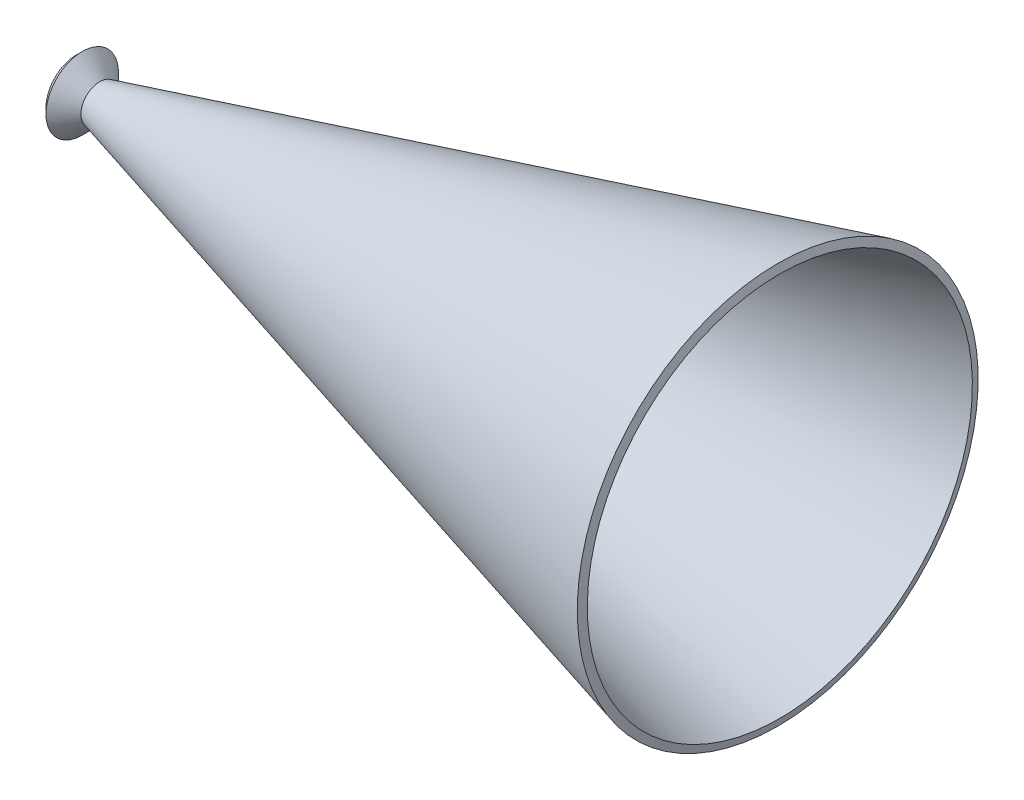
ISO-10303-21;
HEADER;
FILE_DESCRIPTION(('STEP AP214'),'2;1');
FILE_NAME('part.step','',(''),(''),'','','');
FILE_SCHEMA(('AUTOMOTIVE_DESIGN { 1 0 10303 214 1 1 1 1 }'));
ENDSEC;
DATA;
#1=APPLICATION_CONTEXT('core data for automotive mechanical design processes');
#2=APPLICATION_PROTOCOL_DEFINITION('international standard','automotive_design',2000,#1);
#3=PRODUCT_CONTEXT('',#1,'mechanical');
#4=PRODUCT('Part','Part','',(#3));
#5=PRODUCT_RELATED_PRODUCT_CATEGORY('part','',(#4));
#6=PRODUCT_DEFINITION_FORMATION('','',#4);
#7=PRODUCT_DEFINITION_CONTEXT('part definition',#1,'design');
#8=PRODUCT_DEFINITION('design','',#6,#7);
#9=PRODUCT_DEFINITION_SHAPE('','',#8);
#10=(LENGTH_UNIT() NAMED_UNIT(*) SI_UNIT(.MILLI.,.METRE.));
#11=(NAMED_UNIT(*) PLANE_ANGLE_UNIT() SI_UNIT($,.RADIAN.));
#12=(NAMED_UNIT(*) SI_UNIT($,.STERADIAN.) SOLID_ANGLE_UNIT());
#13=UNCERTAINTY_MEASURE_WITH_UNIT(LENGTH_MEASURE(1.E-05),#10,'distance_accuracy_value','');
#14=(GEOMETRIC_REPRESENTATION_CONTEXT(3) GLOBAL_UNCERTAINTY_ASSIGNED_CONTEXT((#13)) GLOBAL_UNIT_ASSIGNED_CONTEXT((#10,
#11,#12)) REPRESENTATION_CONTEXT('',''));
#15=CARTESIAN_POINT('',(0.,0.,0.));
#16=DIRECTION('',(0.,0.,1.));
#17=DIRECTION('',(1.,0.,0.));
#18=AXIS2_PLACEMENT_3D('',#15,#16,#17);
#19=CARTESIAN_POINT('',(-9.16446609406728,0.,0.));
#20=DIRECTION('',(1.,0.,0.));
#21=DIRECTION('',(0.,1.,0.));
#22=AXIS2_PLACEMENT_3D('',#19,#20,#21);
#23=CONICAL_SURFACE('',#22,22.1088339059328,0.785398163397452);
#24=CARTESIAN_POINT('',(-12.7,0.,0.));
#25=DIRECTION('',(-1.,0.,0.));
#26=DIRECTION('',(0.,-1.,0.));
#27=AXIS2_PLACEMENT_3D('',#24,#25,#26);
#28=CIRCLE('',#27,18.5733);
#29=CARTESIAN_POINT('',(-12.7,-18.5733,0.));
#30=VERTEX_POINT('',#29);
#31=EDGE_CURVE('E57',#30,#30,#28,.T.);
#32=ORIENTED_EDGE('',*,*,#31,.F.);
#33=EDGE_LOOP('',(#32));
#34=FACE_BOUND('',#33,.T.);
#35=CARTESIAN_POINT('',(-9.16446609406728,0.,0.));
#36=DIRECTION('',(-1.,0.,0.));
#37=DIRECTION('',(0.,-1.,0.));
#38=AXIS2_PLACEMENT_3D('',#35,#36,#37);
#39=CIRCLE('',#38,22.1088339059328);
#40=CARTESIAN_POINT('',(-9.16446609406727,-22.1088339059328,0.));
#41=VERTEX_POINT('',#40);
#42=EDGE_CURVE('E10',#41,#41,#39,.T.);
#43=ORIENTED_EDGE('',*,*,#42,.T.);
#44=EDGE_LOOP('',(#43));
#45=FACE_BOUND('',#44,.T.);
#46=ADVANCED_FACE('F35',(#34,#45),#23,.T.);
#47=CARTESIAN_POINT('',(1.49429245361343,0.,0.));
#48=DIRECTION('',(-1.,0.,0.));
#49=DIRECTION('',(0.,-1.,0.));
#50=AXIS2_PLACEMENT_3D('',#47,#48,#49);
#51=CONICAL_SURFACE('',#50,11.450075358252,0.78539816339745);
#52=ORIENTED_EDGE('',*,*,#42,.F.);
#53=EDGE_LOOP('',(#52));
#54=FACE_BOUND('',#53,.T.);
#55=CARTESIAN_POINT('',(1.49429245361343,0.,0.));
#56=DIRECTION('',(-1.,0.,0.));
#57=DIRECTION('',(0.,-1.,0.));
#58=AXIS2_PLACEMENT_3D('',#55,#56,#57);
#59=CIRCLE('',#58,11.450075358252);
#60=CARTESIAN_POINT('',(1.49429245361343,11.4500753582521,0.));
#61=VERTEX_POINT('',#60);
#62=EDGE_CURVE('E41',#61,#61,#59,.T.);
#63=ORIENTED_EDGE('',*,*,#62,.T.);
#64=EDGE_LOOP('',(#63));
#65=FACE_BOUND('',#64,.T.);
#66=ADVANCED_FACE('F64',(#54,#65),#51,.T.);
#67=CARTESIAN_POINT('',(415.205904774487,0.,0.));
#68=DIRECTION('',(1.,0.,0.));
#69=DIRECTION('',(0.,1.,0.));
#70=AXIS2_PLACEMENT_3D('',#67,#68,#69);
#71=CONICAL_SURFACE('',#70,122.303767779008,0.26179938779915);
#72=CARTESIAN_POINT('',(415.205904774487,0.,0.));
#73=DIRECTION('',(-1.,0.,0.));
#74=DIRECTION('',(0.,-1.,0.));
#75=AXIS2_PLACEMENT_3D('',#72,#73,#74);
#76=CIRCLE('',#75,122.303767779008);
#77=CARTESIAN_POINT('',(415.205904774487,122.303767779008,0.));
#78=VERTEX_POINT('',#77);
#79=EDGE_CURVE('E45',#78,#78,#76,.T.);
#80=CARTESIAN_POINT('',(1.49429245361343,11.4500753582521,0.));
#81=CARTESIAN_POINT('',(5.8037884152892,12.6048013209683,0.));
#82=CARTESIAN_POINT('',(10.113284376965,13.7595272836845,0.));
#83=CARTESIAN_POINT('',(18.7322763003165,16.0689792091169,0.));
#84=CARTESIAN_POINT('',(23.0417722619923,17.2237051718331,0.));
#85=CARTESIAN_POINT('',(31.6607641853438,19.5331570972655,0.));
#86=CARTESIAN_POINT('',(35.9702601470196,20.6878830599818,0.));
#87=CARTESIAN_POINT('',(44.5892520703711,22.9973349854142,0.));
#88=CARTESIAN_POINT('',(48.8987480320469,24.1520609481304,0.));
#89=CARTESIAN_POINT('',(57.5177399553984,26.4615128735628,0.));
#90=CARTESIAN_POINT('',(61.8272359170742,27.616238836279,0.));
#91=CARTESIAN_POINT('',(70.4462278404257,29.9256907617114,0.));
#92=CARTESIAN_POINT('',(74.7557238021015,31.0804167244276,0.));
#93=CARTESIAN_POINT('',(83.3747157254531,33.3898686498601,0.));
#94=CARTESIAN_POINT('',(87.6842116871288,34.5445946125763,0.));
#95=CARTESIAN_POINT('',(96.3032036104804,36.8540465380087,0.));
#96=CARTESIAN_POINT('',(100.612699572156,38.0087725007249,0.));
#97=CARTESIAN_POINT('',(109.231691495508,40.3182244261573,0.));
#98=CARTESIAN_POINT('',(113.541187457183,41.4729503888735,0.));
#99=CARTESIAN_POINT('',(122.160179380535,43.782402314306,0.));
#100=CARTESIAN_POINT('',(126.469675342211,44.9371282770222,0.));
#101=CARTESIAN_POINT('',(135.088667265562,47.2465802024546,0.));
#102=CARTESIAN_POINT('',(139.398163227238,48.4013061651708,0.));
#103=CARTESIAN_POINT('',(148.01715515059,50.7107580906032,0.));
#104=CARTESIAN_POINT('',(152.326651112265,51.8654840533194,0.));
#105=CARTESIAN_POINT('',(160.945643035617,54.1749359787519,0.));
#106=CARTESIAN_POINT('',(165.255138997293,55.3296619414681,0.));
#107=CARTESIAN_POINT('',(173.874130920644,57.6391138669005,0.));
#108=CARTESIAN_POINT('',(178.18362688232,58.7938398296167,0.));
#109=CARTESIAN_POINT('',(186.802618805672,61.1032917550491,0.));
#110=CARTESIAN_POINT('',(191.112114767347,62.2580177177653,0.));
#111=CARTESIAN_POINT('',(199.731106690699,64.5674696431978,0.));
#112=CARTESIAN_POINT('',(204.040602652375,65.722195605914,0.));
#113=CARTESIAN_POINT('',(212.659594575726,68.0316475313464,0.));
#114=CARTESIAN_POINT('',(216.969090537402,69.1863734940626,0.));
#115=CARTESIAN_POINT('',(225.588082460753,71.495825419495,0.));
#116=CARTESIAN_POINT('',(229.897578422429,72.6505513822113,0.));
#117=CARTESIAN_POINT('',(238.516570345781,74.9600033076437,0.));
#118=CARTESIAN_POINT('',(242.826066307457,76.1147292703599,0.));
#119=CARTESIAN_POINT('',(251.445058230808,78.4241811957923,0.));
#120=CARTESIAN_POINT('',(255.754554192484,79.5789071585085,0.));
#121=CARTESIAN_POINT('',(264.373546115835,81.8883590839409,0.));
#122=CARTESIAN_POINT('',(268.683042077511,83.0430850466572,0.));
#123=CARTESIAN_POINT('',(277.302034000863,85.3525369720896,0.));
#124=CARTESIAN_POINT('',(281.611529962538,86.5072629348058,0.));
#125=CARTESIAN_POINT('',(290.23052188589,88.8167148602382,0.));
#126=CARTESIAN_POINT('',(294.540017847566,89.9714408229544,0.));
#127=CARTESIAN_POINT('',(303.159009770917,92.2808927483868,0.));
#128=CARTESIAN_POINT('',(307.468505732593,93.435618711103,0.));
#129=CARTESIAN_POINT('',(316.087497655945,95.7450706365355,0.));
#130=CARTESIAN_POINT('',(320.39699361762,96.8997965992517,0.));
#131=CARTESIAN_POINT('',(329.015985540972,99.2092485246841,0.));
#132=CARTESIAN_POINT('',(333.325481502648,100.3639744874,0.));
#133=CARTESIAN_POINT('',(341.944473425999,102.673426412833,0.));
#134=CARTESIAN_POINT('',(346.253969387675,103.828152375549,0.));
#135=CARTESIAN_POINT('',(354.872961311027,106.137604300981,0.));
#136=CARTESIAN_POINT('',(359.182457272702,107.292330263698,0.));
#137=CARTESIAN_POINT('',(367.801449196054,109.60178218913,0.));
#138=CARTESIAN_POINT('',(372.11094515773,110.756508151846,0.));
#139=CARTESIAN_POINT('',(380.729937081081,113.065960077279,0.));
#140=CARTESIAN_POINT('',(385.039433042757,114.220686039995,0.));
#141=CARTESIAN_POINT('',(393.658424966108,116.530137965427,0.));
#142=CARTESIAN_POINT('',(397.967920927784,117.684863928143,0.));
#143=CARTESIAN_POINT('',(406.586912851136,119.994315853576,0.));
#144=CARTESIAN_POINT('',(410.896408812812,121.149041816292,0.));
#145=CARTESIAN_POINT('',(415.205904774487,122.303767779008,0.));
#146=B_SPLINE_CURVE_WITH_KNOTS('',3,(#80,#81,#82,#83,#84,#85,#86,#87,#88,#89,#90,#91,#92,#93,
#94,#95,#96,#97,#98,#99,#100,#101,#102,#103,#104,#105,#106,#107,#108,#109,#110,#111,#112,#113,
#114,#115,#116,#117,#118,#119,#120,#121,#122,#123,#124,#125,#126,#127,#128,#129,#130,#131,#132,
#133,#134,#135,#136,#137,#138,#139,#140,#141,#142,#143,#144,#145),.UNSPECIFIED.,.F.,.F.,(4,2,2,
2,2,2,2,2,2,2,2,2,2,2,2,2,2,2,2,2,2,2,2,2,2,2,2,2,2,2,2,2,4),(0.,13.3845555560891,
26.7691111121782,40.1536666682674,53.5382222243564,66.9227777804455,80.3073333365346,
93.6918888926238,107.076444448713,120.461000004802,133.845555560891,147.23011111698,
160.614666673069,173.999222229158,187.383777785247,200.768333341337,214.152888897426,
227.537444453515,240.922000009604,254.306555565693,267.691111121782,281.075666677871,
294.46022223396,307.844777790049,321.229333346139,334.613888902228,347.998444458317,
361.383000014406,374.767555570495,388.152111126584,401.536666682673,414.921222238763,
428.305777794852),.UNSPECIFIED.);
#147=EDGE_CURVE('BSEAM68',#61,#78,#146,.T.);
#148=ORIENTED_EDGE('',*,*,#62,.F.);
#149=ORIENTED_EDGE('',*,*,#79,.T.);
#150=ORIENTED_EDGE('',*,*,#147,.T.);
#151=ORIENTED_EDGE('',*,*,#147,.F.);
#152=EDGE_LOOP('',(#148,#150,#149,#151));
#153=FACE_BOUND('',#152,.T.);
#154=ADVANCED_FACE('F68',(#153),#71,.T.);
#155=CARTESIAN_POINT('',(416.5,0.,0.));
#156=DIRECTION('',(-1.,0.,0.));
#157=DIRECTION('',(0.,-1.,0.));
#158=AXIS2_PLACEMENT_3D('',#155,#156,#157);
#159=CONICAL_SURFACE('',#158,117.474138647563,1.30899693899575);
#160=ORIENTED_EDGE('',*,*,#79,.F.);
#161=EDGE_LOOP('',(#160));
#162=FACE_BOUND('',#161,.T.);
#163=CARTESIAN_POINT('',(416.5,0.,0.));
#164=DIRECTION('',(-1.,0.,0.));
#165=DIRECTION('',(0.,-1.,0.));
#166=AXIS2_PLACEMENT_3D('',#163,#164,#165);
#167=CIRCLE('',#166,117.474138647563);
#168=CARTESIAN_POINT('',(416.5,117.474138647563,0.));
#169=VERTEX_POINT('',#168);
#170=EDGE_CURVE('E49',#169,#169,#167,.T.);
#171=ORIENTED_EDGE('',*,*,#170,.T.);
#172=EDGE_LOOP('',(#171));
#173=FACE_BOUND('',#172,.T.);
#174=ADVANCED_FACE('F73',(#162,#173),#159,.T.);
#175=CARTESIAN_POINT('',(0.,0.,0.));
#176=DIRECTION('',(1.,0.,0.));
#177=DIRECTION('',(0.,1.,0.));
#178=AXIS2_PLACEMENT_3D('',#175,#176,#177);
#179=CONICAL_SURFACE('',#178,5.87329999999998,0.26179938779915);
#180=CARTESIAN_POINT('',(0.,0.,0.));
#181=DIRECTION('',(-1.,0.,0.));
#182=DIRECTION('',(0.,-1.,0.));
#183=AXIS2_PLACEMENT_3D('',#180,#181,#182);
#184=CIRCLE('',#183,5.87329999999998);
#185=CARTESIAN_POINT('',(0.,5.8733,0.));
#186=VERTEX_POINT('',#185);
#187=EDGE_CURVE('E54',#186,#186,#184,.T.);
#188=CARTESIAN_POINT('',(416.5,117.474138647563,0.));
#189=CARTESIAN_POINT('',(412.161458333333,116.311629911651,0.));
#190=CARTESIAN_POINT('',(407.822916666667,115.149121175739,0.));
#191=CARTESIAN_POINT('',(399.145833333333,112.824103703915,0.));
#192=CARTESIAN_POINT('',(394.807291666667,111.661594968002,0.));
#193=CARTESIAN_POINT('',(386.130208333333,109.336577496178,0.));
#194=CARTESIAN_POINT('',(381.791666666667,108.174068760266,0.));
#195=CARTESIAN_POINT('',(373.114583333333,105.849051288442,0.));
#196=CARTESIAN_POINT('',(368.776041666667,104.68654255253,0.));
#197=CARTESIAN_POINT('',(360.098958333333,102.361525080706,0.));
#198=CARTESIAN_POINT('',(355.760416666667,101.199016344793,0.));
#199=CARTESIAN_POINT('',(347.083333333333,98.8739988729692,0.));
#200=CARTESIAN_POINT('',(342.744791666667,97.7114901370571,0.));
#201=CARTESIAN_POINT('',(334.067708333333,95.3864726652328,0.));
#202=CARTESIAN_POINT('',(329.729166666667,94.2239639293207,0.));
#203=CARTESIAN_POINT('',(321.052083333333,91.8989464574965,0.));
#204=CARTESIAN_POINT('',(316.713541666667,90.7364377215844,0.));
#205=CARTESIAN_POINT('',(308.036458333333,88.4114202497601,0.));
#206=CARTESIAN_POINT('',(303.697916666667,87.248911513848,0.));
#207=CARTESIAN_POINT('',(295.020833333333,84.9238940420238,0.));
#208=CARTESIAN_POINT('',(290.682291666667,83.7613853061117,0.));
#209=CARTESIAN_POINT('',(282.005208333333,81.4363678342875,0.));
#210=CARTESIAN_POINT('',(277.666666666667,80.2738590983754,0.));
#211=CARTESIAN_POINT('',(268.989583333333,77.9488416265511,0.));
#212=CARTESIAN_POINT('',(264.651041666667,76.786332890639,0.));
#213=CARTESIAN_POINT('',(255.973958333333,74.4613154188148,0.));
#214=CARTESIAN_POINT('',(251.635416666667,73.2988066829027,0.));
#215=CARTESIAN_POINT('',(242.958333333333,70.9737892110784,0.));
#216=CARTESIAN_POINT('',(238.619791666667,69.8112804751663,0.));
#217=CARTESIAN_POINT('',(229.942708333333,67.4862630033421,0.));
#218=CARTESIAN_POINT('',(225.604166666667,66.32375426743,0.));
#219=CARTESIAN_POINT('',(216.927083333333,63.9987367956057,0.));
#220=CARTESIAN_POINT('',(212.588541666667,62.8362280596936,0.));
#221=CARTESIAN_POINT('',(203.911458333333,60.5112105878694,0.));
#222=CARTESIAN_POINT('',(199.572916666667,59.3487018519573,0.));
#223=CARTESIAN_POINT('',(190.895833333333,57.023684380133,0.));
#224=CARTESIAN_POINT('',(186.557291666667,55.8611756442209,0.));
#225=CARTESIAN_POINT('',(177.880208333333,53.5361581723967,0.));
#226=CARTESIAN_POINT('',(173.541666666667,52.3736494364846,0.));
#227=CARTESIAN_POINT('',(164.864583333333,50.0486319646603,0.));
#228=CARTESIAN_POINT('',(160.526041666667,48.8861232287482,0.));
#229=CARTESIAN_POINT('',(151.848958333333,46.561105756924,0.));
#230=CARTESIAN_POINT('',(147.510416666667,45.3985970210119,0.));
#231=CARTESIAN_POINT('',(138.833333333333,43.0735795491877,0.));
#232=CARTESIAN_POINT('',(134.494791666667,41.9110708132755,0.));
#233=CARTESIAN_POINT('',(125.817708333333,39.5860533414513,0.));
#234=CARTESIAN_POINT('',(121.479166666667,38.4235446055392,0.));
#235=CARTESIAN_POINT('',(112.802083333333,36.098527133715,0.));
#236=CARTESIAN_POINT('',(108.463541666667,34.9360183978029,0.));
#237=CARTESIAN_POINT('',(99.7864583333333,32.6110009259786,0.));
#238=CARTESIAN_POINT('',(95.4479166666667,31.4484921900665,0.));
#239=CARTESIAN_POINT('',(86.7708333333333,29.1234747182423,0.));
#240=CARTESIAN_POINT('',(82.4322916666667,27.9609659823302,0.));
#241=CARTESIAN_POINT('',(73.7552083333333,25.6359485105059,0.));
#242=CARTESIAN_POINT('',(69.4166666666667,24.4734397745938,0.));
#243=CARTESIAN_POINT('',(60.7395833333333,22.1484223027696,0.));
#244=CARTESIAN_POINT('',(56.4010416666667,20.9859135668575,0.));
#245=CARTESIAN_POINT('',(47.7239583333333,18.6608960950333,0.));
#246=CARTESIAN_POINT('',(43.3854166666667,17.4983873591211,0.));
#247=CARTESIAN_POINT('',(34.7083333333333,15.1733698872969,0.));
#248=CARTESIAN_POINT('',(30.3697916666667,14.0108611513848,0.));
#249=CARTESIAN_POINT('',(21.6927083333333,11.6858436795606,0.));
#250=CARTESIAN_POINT('',(17.3541666666667,10.5233349436485,0.));
#251=CARTESIAN_POINT('',(8.67708333333331,8.19831747182423,0.));
#252=CARTESIAN_POINT('',(4.33854166666666,7.03580873591211,0.));
#253=CARTESIAN_POINT('',(0.,5.8733,0.));
#254=B_SPLINE_CURVE_WITH_KNOTS('',3,(#188,#189,#190,#191,#192,#193,#194,#195,#196,#197,#198,
#199,#200,#201,#202,#203,#204,#205,#206,#207,#208,#209,#210,#211,#212,#213,#214,#215,#216,#217,
#218,#219,#220,#221,#222,#223,#224,#225,#226,#227,#228,#229,#230,#231,#232,#233,#234,#235,#236,
#237,#238,#239,#240,#241,#242,#243,#244,#245,#246,#247,#248,#249,#250,#251,#252,#253),
.UNSPECIFIED.,.F.,.F.,(4,2,2,2,2,2,2,2,2,2,2,2,2,2,2,2,2,2,2,2,2,2,2,2,2,2,2,2,2,2,2,2,4),(0.,
13.47476653565,26.9495330713,40.42429960695,53.8990661426,67.3738326782499,80.8485992138999,
94.3233657495499,107.7981322852,121.27289882085,134.7476653565,148.22243189215,161.6971984278,
175.17196496345,188.6467314991,202.12149803475,215.5962645704,229.07103110605,242.5457976417,
256.02056417735,269.495330713,282.97009724865,296.4448637843,309.91963031995,323.3943968556,
336.86916339125,350.3439299269,363.81869646255,377.2934629982,390.76822953385,404.2429960695,
417.71776260515,431.1925291408),.UNSPECIFIED.);
#255=EDGE_CURVE('BSEAM79',#169,#186,#254,.T.);
#256=ORIENTED_EDGE('',*,*,#170,.F.);
#257=ORIENTED_EDGE('',*,*,#187,.T.);
#258=ORIENTED_EDGE('',*,*,#255,.T.);
#259=ORIENTED_EDGE('',*,*,#255,.F.);
#260=EDGE_LOOP('',(#256,#258,#257,#259));
#261=FACE_BOUND('',#260,.T.);
#262=ADVANCED_FACE('F79',(#261),#179,.F.);
#263=CARTESIAN_POINT('',(-12.7,0.,0.));
#264=DIRECTION('',(-1.,0.,0.));
#265=DIRECTION('',(0.,-1.,0.));
#266=AXIS2_PLACEMENT_3D('',#263,#264,#265);
#267=CONICAL_SURFACE('',#266,18.5733,0.78539816339745);
#268=ORIENTED_EDGE('',*,*,#187,.F.);
#269=EDGE_LOOP('',(#268));
#270=FACE_BOUND('',#269,.T.);
#271=ORIENTED_EDGE('',*,*,#31,.T.);
#272=EDGE_LOOP('',(#271));
#273=FACE_BOUND('',#272,.T.);
#274=ADVANCED_FACE('F61',(#270,#273),#267,.F.);
#275=CLOSED_SHELL('',(#46,#66,#154,#174,#262,#274));
#276=MANIFOLD_SOLID_BREP('B2',#275);
#277=ADVANCED_BREP_SHAPE_REPRESENTATION('',(#18,#276),#14);
#278=SHAPE_DEFINITION_REPRESENTATION(#9,#277);
ENDSEC;
END-ISO-10303-21;
